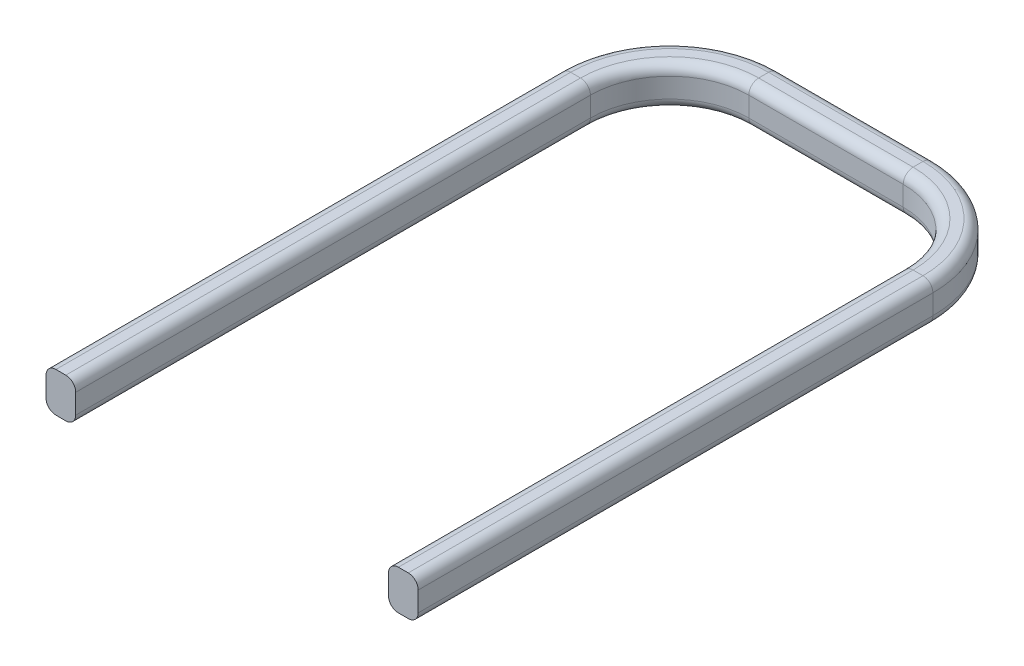
ISO-10303-21;
HEADER;
FILE_DESCRIPTION(('STEP AP214'),'2;1');
FILE_NAME('part.step','',(''),(''),'','','');
FILE_SCHEMA(('AUTOMOTIVE_DESIGN { 1 0 10303 214 1 1 1 1 }'));
ENDSEC;
DATA;
#1=APPLICATION_CONTEXT('core data for automotive mechanical design processes');
#2=APPLICATION_PROTOCOL_DEFINITION('international standard','automotive_design',2000,#1);
#3=PRODUCT_CONTEXT('',#1,'mechanical');
#4=PRODUCT('Part','Part','',(#3));
#5=PRODUCT_RELATED_PRODUCT_CATEGORY('part','',(#4));
#6=PRODUCT_DEFINITION_FORMATION('','',#4);
#7=PRODUCT_DEFINITION_CONTEXT('part definition',#1,'design');
#8=PRODUCT_DEFINITION('design','',#6,#7);
#9=PRODUCT_DEFINITION_SHAPE('','',#8);
#10=(LENGTH_UNIT() NAMED_UNIT(*) SI_UNIT(.MILLI.,.METRE.));
#11=(NAMED_UNIT(*) PLANE_ANGLE_UNIT() SI_UNIT($,.RADIAN.));
#12=(NAMED_UNIT(*) SI_UNIT($,.STERADIAN.) SOLID_ANGLE_UNIT());
#13=UNCERTAINTY_MEASURE_WITH_UNIT(LENGTH_MEASURE(1.E-05),#10,'distance_accuracy_value','');
#14=(GEOMETRIC_REPRESENTATION_CONTEXT(3) GLOBAL_UNCERTAINTY_ASSIGNED_CONTEXT((#13)) GLOBAL_UNIT_ASSIGNED_CONTEXT((#10,
#11,#12)) REPRESENTATION_CONTEXT('',''));
#15=CARTESIAN_POINT('',(0.,0.,0.));
#16=DIRECTION('',(0.,0.,1.));
#17=DIRECTION('',(1.,0.,0.));
#18=AXIS2_PLACEMENT_3D('',#15,#16,#17);
#19=CARTESIAN_POINT('',(0.,0.,0.));
#20=DIRECTION('',(0.,0.,1.));
#21=DIRECTION('',(1.,0.,0.));
#22=AXIS2_PLACEMENT_3D('',#19,#20,#21);
#23=PLANE('',#22);
#24=DIRECTION('',(0.,-1.,0.));
#25=VECTOR('',#24,1.);
#26=CARTESIAN_POINT('',(-4.7,0.,0.));
#27=LINE('',#26,#25);
#28=CARTESIAN_POINT('',(-4.7,0.75,0.));
#29=VERTEX_POINT('',#28);
#30=CARTESIAN_POINT('',(-4.7,0.25,0.));
#31=VERTEX_POINT('',#30);
#32=EDGE_CURVE('E493',#29,#31,#27,.T.);
#33=ORIENTED_EDGE('',*,*,#32,.T.);
#34=CARTESIAN_POINT('',(-4.45,0.25,0.));
#35=DIRECTION('',(0.,0.,1.));
#36=DIRECTION('',(1.,0.,0.));
#37=AXIS2_PLACEMENT_3D('',#34,#35,#36);
#38=CIRCLE('',#37,0.25);
#39=CARTESIAN_POINT('',(-4.45,0.,0.));
#40=VERTEX_POINT('',#39);
#41=EDGE_CURVE('E295',#31,#40,#38,.T.);
#42=ORIENTED_EDGE('',*,*,#41,.T.);
#43=DIRECTION('',(1.,0.,0.));
#44=VECTOR('',#43,1.);
#45=CARTESIAN_POINT('',(-3.95,0.,0.));
#46=LINE('',#45,#44);
#47=CARTESIAN_POINT('',(-4.2,0.,0.));
#48=VERTEX_POINT('',#47);
#49=EDGE_CURVE('E236',#40,#48,#46,.T.);
#50=ORIENTED_EDGE('',*,*,#49,.T.);
#51=CARTESIAN_POINT('',(-4.2,0.25,0.));
#52=DIRECTION('',(0.,0.,1.));
#53=DIRECTION('',(1.,0.,0.));
#54=AXIS2_PLACEMENT_3D('',#51,#52,#53);
#55=CIRCLE('',#54,0.25);
#56=CARTESIAN_POINT('',(-3.95,0.25,0.));
#57=VERTEX_POINT('',#56);
#58=EDGE_CURVE('E292',#48,#57,#55,.T.);
#59=ORIENTED_EDGE('',*,*,#58,.T.);
#60=DIRECTION('',(0.,1.,0.));
#61=VECTOR('',#60,1.);
#62=CARTESIAN_POINT('',(-3.95,0.,0.));
#63=LINE('',#62,#61);
#64=CARTESIAN_POINT('',(-3.95,0.75,0.));
#65=VERTEX_POINT('',#64);
#66=EDGE_CURVE('E421',#57,#65,#63,.T.);
#67=ORIENTED_EDGE('',*,*,#66,.T.);
#68=CARTESIAN_POINT('',(-4.2,0.75,0.));
#69=DIRECTION('',(0.,0.,1.));
#70=DIRECTION('',(1.,0.,0.));
#71=AXIS2_PLACEMENT_3D('',#68,#69,#70);
#72=CIRCLE('',#71,0.25);
#73=CARTESIAN_POINT('',(-4.2,1.,0.));
#74=VERTEX_POINT('',#73);
#75=EDGE_CURVE('E286',#65,#74,#72,.T.);
#76=ORIENTED_EDGE('',*,*,#75,.T.);
#77=DIRECTION('',(-1.,0.,0.));
#78=VECTOR('',#77,1.);
#79=CARTESIAN_POINT('',(-3.95,1.,0.));
#80=LINE('',#79,#78);
#81=CARTESIAN_POINT('',(-4.45,1.,0.));
#82=VERTEX_POINT('',#81);
#83=EDGE_CURVE('E490',#74,#82,#80,.T.);
#84=ORIENTED_EDGE('',*,*,#83,.T.);
#85=CARTESIAN_POINT('',(-4.45,0.75,0.));
#86=DIRECTION('',(0.,0.,1.));
#87=DIRECTION('',(1.,0.,0.));
#88=AXIS2_PLACEMENT_3D('',#85,#86,#87);
#89=CIRCLE('',#88,0.25);
#90=EDGE_CURVE('E289',#82,#29,#89,.T.);
#91=ORIENTED_EDGE('',*,*,#90,.T.);
#92=EDGE_LOOP('',(#33,#42,#50,#59,#67,#76,#84,#91));
#93=FACE_BOUND('',#92,.T.);
#94=ADVANCED_FACE('F39',(#93),#23,.T.);
#95=CARTESIAN_POINT('',(0.,0.,0.));
#96=DIRECTION('',(0.,0.,-1.));
#97=DIRECTION('',(-1.,0.,0.));
#98=AXIS2_PLACEMENT_3D('',#95,#96,#97);
#99=PLANE('',#98);
#100=DIRECTION('',(0.,1.,0.));
#101=VECTOR('',#100,1.);
#102=CARTESIAN_POINT('',(3.95,0.,0.));
#103=LINE('',#102,#101);
#104=CARTESIAN_POINT('',(3.95,0.25,0.));
#105=VERTEX_POINT('',#104);
#106=CARTESIAN_POINT('',(3.95,0.75,0.));
#107=VERTEX_POINT('',#106);
#108=EDGE_CURVE('E273',#105,#107,#103,.T.);
#109=ORIENTED_EDGE('',*,*,#108,.F.);
#110=CARTESIAN_POINT('',(4.2,0.25,0.));
#111=DIRECTION('',(0.,0.,-1.));
#112=DIRECTION('',(-1.,0.,0.));
#113=AXIS2_PLACEMENT_3D('',#110,#111,#112);
#114=CIRCLE('',#113,0.25);
#115=CARTESIAN_POINT('',(4.2,0.,0.));
#116=VERTEX_POINT('',#115);
#117=EDGE_CURVE('E345',#105,#116,#114,.F.);
#118=ORIENTED_EDGE('',*,*,#117,.T.);
#119=DIRECTION('',(-1.,0.,0.));
#120=VECTOR('',#119,1.);
#121=CARTESIAN_POINT('',(3.95,0.,0.));
#122=LINE('',#121,#120);
#123=CARTESIAN_POINT('',(4.45,0.,0.));
#124=VERTEX_POINT('',#123);
#125=EDGE_CURVE('E275',#124,#116,#122,.T.);
#126=ORIENTED_EDGE('',*,*,#125,.F.);
#127=CARTESIAN_POINT('',(4.45,0.25,0.));
#128=DIRECTION('',(0.,0.,-1.));
#129=DIRECTION('',(-1.,0.,0.));
#130=AXIS2_PLACEMENT_3D('',#127,#128,#129);
#131=CIRCLE('',#130,0.25);
#132=CARTESIAN_POINT('',(4.7,0.25,0.));
#133=VERTEX_POINT('',#132);
#134=EDGE_CURVE('E336',#124,#133,#131,.F.);
#135=ORIENTED_EDGE('',*,*,#134,.T.);
#136=DIRECTION('',(0.,-1.,0.));
#137=VECTOR('',#136,1.);
#138=CARTESIAN_POINT('',(4.7,0.,0.));
#139=LINE('',#138,#137);
#140=CARTESIAN_POINT('',(4.7,0.75,0.));
#141=VERTEX_POINT('',#140);
#142=EDGE_CURVE('E279',#141,#133,#139,.T.);
#143=ORIENTED_EDGE('',*,*,#142,.F.);
#144=CARTESIAN_POINT('',(4.45,0.75,0.));
#145=DIRECTION('',(0.,0.,-1.));
#146=DIRECTION('',(-1.,0.,0.));
#147=AXIS2_PLACEMENT_3D('',#144,#145,#146);
#148=CIRCLE('',#147,0.25);
#149=CARTESIAN_POINT('',(4.45,1.,0.));
#150=VERTEX_POINT('',#149);
#151=EDGE_CURVE('E342',#141,#150,#148,.F.);
#152=ORIENTED_EDGE('',*,*,#151,.T.);
#153=DIRECTION('',(1.,0.,0.));
#154=VECTOR('',#153,1.);
#155=CARTESIAN_POINT('',(3.95,1.,0.));
#156=LINE('',#155,#154);
#157=CARTESIAN_POINT('',(4.2,1.,0.));
#158=VERTEX_POINT('',#157);
#159=EDGE_CURVE('E508',#158,#150,#156,.T.);
#160=ORIENTED_EDGE('',*,*,#159,.F.);
#161=CARTESIAN_POINT('',(4.2,0.75,0.));
#162=DIRECTION('',(0.,0.,-1.));
#163=DIRECTION('',(-1.,0.,0.));
#164=AXIS2_PLACEMENT_3D('',#161,#162,#163);
#165=CIRCLE('',#164,0.25);
#166=EDGE_CURVE('E339',#158,#107,#165,.F.);
#167=ORIENTED_EDGE('',*,*,#166,.T.);
#168=EDGE_LOOP('',(#109,#118,#126,#135,#143,#152,#160,#167));
#169=FACE_BOUND('',#168,.T.);
#170=ADVANCED_FACE('F575',(#169),#99,.F.);
#171=CARTESIAN_POINT('',(-3.95,0.,0.));
#172=DIRECTION('',(-1.,0.,0.));
#173=DIRECTION('',(0.,0.,1.));
#174=AXIS2_PLACEMENT_3D('',#171,#172,#173);
#175=PLANE('',#174);
#176=ORIENTED_EDGE('',*,*,#66,.F.);
#177=DIRECTION('',(0.,0.,-1.));
#178=VECTOR('',#177,1.);
#179=CARTESIAN_POINT('',(-3.95,0.25,0.));
#180=LINE('',#179,#178);
#181=CARTESIAN_POINT('',(-3.95,0.25,-13.));
#182=VERTEX_POINT('',#181);
#183=EDGE_CURVE('E406',#57,#182,#180,.T.);
#184=ORIENTED_EDGE('',*,*,#183,.T.);
#185=DIRECTION('',(0.,1.,0.));
#186=VECTOR('',#185,1.);
#187=CARTESIAN_POINT('',(-3.95,0.,-13.));
#188=LINE('',#187,#186);
#189=CARTESIAN_POINT('',(-3.95,0.75,-13.));
#190=VERTEX_POINT('',#189);
#191=EDGE_CURVE('E484',#182,#190,#188,.T.);
#192=ORIENTED_EDGE('',*,*,#191,.T.);
#193=DIRECTION('',(0.,0.,-1.));
#194=VECTOR('',#193,1.);
#195=CARTESIAN_POINT('',(-3.95,0.75,0.));
#196=LINE('',#195,#194);
#197=EDGE_CURVE('E403',#190,#65,#196,.F.);
#198=ORIENTED_EDGE('',*,*,#197,.T.);
#199=EDGE_LOOP('',(#176,#184,#192,#198));
#200=FACE_BOUND('',#199,.T.);
#201=ADVANCED_FACE('F481',(#200),#175,.F.);
#202=CARTESIAN_POINT('',(-3.95,1.,0.));
#203=DIRECTION('',(0.,-1.,0.));
#204=DIRECTION('',(1.,0.,0.));
#205=AXIS2_PLACEMENT_3D('',#202,#203,#204);
#206=PLANE('',#205);
#207=DIRECTION('',(-1.,0.,0.));
#208=VECTOR('',#207,1.);
#209=CARTESIAN_POINT('',(-3.95,1.,-13.));
#210=LINE('',#209,#208);
#211=CARTESIAN_POINT('',(-4.2,1.,-13.));
#212=VERTEX_POINT('',#211);
#213=CARTESIAN_POINT('',(-4.45,1.,-13.));
#214=VERTEX_POINT('',#213);
#215=EDGE_CURVE('E253',#212,#214,#210,.T.);
#216=ORIENTED_EDGE('',*,*,#215,.T.);
#217=DIRECTION('',(0.,0.,-1.));
#218=VECTOR('',#217,1.);
#219=CARTESIAN_POINT('',(-4.45,1.,0.));
#220=LINE('',#219,#218);
#221=EDGE_CURVE('E11',#214,#82,#220,.F.);
#222=ORIENTED_EDGE('',*,*,#221,.T.);
#223=ORIENTED_EDGE('',*,*,#83,.F.);
#224=DIRECTION('',(0.,0.,-1.));
#225=VECTOR('',#224,1.);
#226=CARTESIAN_POINT('',(-4.2,1.,0.));
#227=LINE('',#226,#225);
#228=EDGE_CURVE('E49',#74,#212,#227,.T.);
#229=ORIENTED_EDGE('',*,*,#228,.T.);
#230=EDGE_LOOP('',(#216,#222,#223,#229));
#231=FACE_BOUND('',#230,.T.);
#232=ADVANCED_FACE('F913',(#231),#206,.F.);
#233=CARTESIAN_POINT('',(-4.7,0.,0.));
#234=DIRECTION('',(1.,0.,0.));
#235=DIRECTION('',(0.,0.,-1.));
#236=AXIS2_PLACEMENT_3D('',#233,#234,#235);
#237=PLANE('',#236);
#238=DIRECTION('',(0.,-1.,0.));
#239=VECTOR('',#238,1.);
#240=CARTESIAN_POINT('',(-4.7,0.,-13.));
#241=LINE('',#240,#239);
#242=CARTESIAN_POINT('',(-4.7,0.75,-13.));
#243=VERTEX_POINT('',#242);
#244=CARTESIAN_POINT('',(-4.7,0.25,-13.));
#245=VERTEX_POINT('',#244);
#246=EDGE_CURVE('E245',#243,#245,#241,.T.);
#247=ORIENTED_EDGE('',*,*,#246,.T.);
#248=DIRECTION('',(0.,0.,-1.));
#249=VECTOR('',#248,1.);
#250=CARTESIAN_POINT('',(-4.7,0.25,0.));
#251=LINE('',#250,#249);
#252=EDGE_CURVE('E210',#245,#31,#251,.F.);
#253=ORIENTED_EDGE('',*,*,#252,.T.);
#254=ORIENTED_EDGE('',*,*,#32,.F.);
#255=DIRECTION('',(0.,0.,-1.));
#256=VECTOR('',#255,1.);
#257=CARTESIAN_POINT('',(-4.7,0.75,0.));
#258=LINE('',#257,#256);
#259=EDGE_CURVE('E238',#29,#243,#258,.T.);
#260=ORIENTED_EDGE('',*,*,#259,.T.);
#261=EDGE_LOOP('',(#247,#253,#254,#260));
#262=FACE_BOUND('',#261,.T.);
#263=ADVANCED_FACE('F623',(#262),#237,.F.);
#264=CARTESIAN_POINT('',(-3.95,0.,0.));
#265=DIRECTION('',(0.,1.,0.));
#266=DIRECTION('',(-1.,0.,0.));
#267=AXIS2_PLACEMENT_3D('',#264,#265,#266);
#268=PLANE('',#267);
#269=ORIENTED_EDGE('',*,*,#49,.F.);
#270=DIRECTION('',(0.,0.,-1.));
#271=VECTOR('',#270,1.);
#272=CARTESIAN_POINT('',(-4.45,0.,0.));
#273=LINE('',#272,#271);
#274=CARTESIAN_POINT('',(-4.45,0.,-13.));
#275=VERTEX_POINT('',#274);
#276=EDGE_CURVE('E209',#40,#275,#273,.T.);
#277=ORIENTED_EDGE('',*,*,#276,.T.);
#278=DIRECTION('',(1.,0.,0.));
#279=VECTOR('',#278,1.);
#280=CARTESIAN_POINT('',(-3.95,0.,-13.));
#281=LINE('',#280,#279);
#282=CARTESIAN_POINT('',(-4.2,0.,-13.));
#283=VERTEX_POINT('',#282);
#284=EDGE_CURVE('E233',#275,#283,#281,.T.);
#285=ORIENTED_EDGE('',*,*,#284,.T.);
#286=DIRECTION('',(0.,0.,-1.));
#287=VECTOR('',#286,1.);
#288=CARTESIAN_POINT('',(-4.2,0.,0.));
#289=LINE('',#288,#287);
#290=EDGE_CURVE('E239',#283,#48,#289,.F.);
#291=ORIENTED_EDGE('',*,*,#290,.T.);
#292=EDGE_LOOP('',(#269,#277,#285,#291));
#293=FACE_BOUND('',#292,.T.);
#294=ADVANCED_FACE('F232',(#293),#268,.F.);
#295=CARTESIAN_POINT('',(-1.95,0.,-13.));
#296=DIRECTION('',(0.,-1.,0.));
#297=DIRECTION('',(0.,0.,-1.));
#298=AXIS2_PLACEMENT_3D('',#295,#296,#297);
#299=CYLINDRICAL_SURFACE('',#298,2.);
#300=ORIENTED_EDGE('',*,*,#191,.F.);
#301=CARTESIAN_POINT('',(-1.95,0.25,-13.));
#302=DIRECTION('',(0.,1.,0.));
#303=DIRECTION('',(0.,0.,1.));
#304=AXIS2_PLACEMENT_3D('',#301,#302,#303);
#305=CIRCLE('',#304,2.);
#306=CARTESIAN_POINT('',(-1.95,0.25,-15.));
#307=VERTEX_POINT('',#306);
#308=EDGE_CURVE('E369',#182,#307,#305,.F.);
#309=ORIENTED_EDGE('',*,*,#308,.T.);
#310=DIRECTION('',(0.,1.,0.));
#311=VECTOR('',#310,1.);
#312=CARTESIAN_POINT('',(-1.95,0.,-15.));
#313=LINE('',#312,#311);
#314=CARTESIAN_POINT('',(-1.95,0.75,-15.));
#315=VERTEX_POINT('',#314);
#316=EDGE_CURVE('E244',#307,#315,#313,.T.);
#317=ORIENTED_EDGE('',*,*,#316,.T.);
#318=CARTESIAN_POINT('',(-1.95,0.75,-13.));
#319=DIRECTION('',(0.,-1.,0.));
#320=DIRECTION('',(0.,0.,-1.));
#321=AXIS2_PLACEMENT_3D('',#318,#319,#320);
#322=CIRCLE('',#321,2.);
#323=EDGE_CURVE('E366',#315,#190,#322,.F.);
#324=ORIENTED_EDGE('',*,*,#323,.T.);
#325=EDGE_LOOP('',(#300,#309,#317,#324));
#326=FACE_BOUND('',#325,.T.);
#327=ADVANCED_FACE('F887',(#326),#299,.F.);
#328=CARTESIAN_POINT('',(-3.95,1.,-13.));
#329=DIRECTION('',(0.,-1.,0.));
#330=DIRECTION('',(0.,0.,-1.));
#331=AXIS2_PLACEMENT_3D('',#328,#329,#330);
#332=PLANE('',#331);
#333=DIRECTION('',(0.,0.,-1.));
#334=VECTOR('',#333,1.);
#335=CARTESIAN_POINT('',(-1.95,1.,-15.));
#336=LINE('',#335,#334);
#337=CARTESIAN_POINT('',(-1.95,1.,-15.25));
#338=VERTEX_POINT('',#337);
#339=CARTESIAN_POINT('',(-1.95,1.,-15.5));
#340=VERTEX_POINT('',#339);
#341=EDGE_CURVE('E250',#338,#340,#336,.T.);
#342=ORIENTED_EDGE('',*,*,#341,.T.);
#343=CARTESIAN_POINT('',(-1.95,1.,-13.));
#344=DIRECTION('',(0.,-1.,0.));
#345=DIRECTION('',(0.,0.,-1.));
#346=AXIS2_PLACEMENT_3D('',#343,#344,#345);
#347=CIRCLE('',#346,2.5);
#348=EDGE_CURVE('E57',#340,#214,#347,.F.);
#349=ORIENTED_EDGE('',*,*,#348,.T.);
#350=ORIENTED_EDGE('',*,*,#215,.F.);
#351=CARTESIAN_POINT('',(-1.95,1.,-13.));
#352=DIRECTION('',(0.,-1.,0.));
#353=DIRECTION('',(0.,0.,-1.));
#354=AXIS2_PLACEMENT_3D('',#351,#352,#353);
#355=CIRCLE('',#354,2.25);
#356=EDGE_CURVE('E398',#212,#338,#355,.T.);
#357=ORIENTED_EDGE('',*,*,#356,.T.);
#358=EDGE_LOOP('',(#342,#349,#350,#357));
#359=FACE_BOUND('',#358,.T.);
#360=ADVANCED_FACE('F878',(#359),#332,.F.);
#361=CARTESIAN_POINT('',(-1.95,0.,-13.));
#362=DIRECTION('',(0.,-1.,0.));
#363=DIRECTION('',(0.,0.,-1.));
#364=AXIS2_PLACEMENT_3D('',#361,#362,#363);
#365=CYLINDRICAL_SURFACE('',#364,2.75);
#366=DIRECTION('',(0.,-1.,0.));
#367=VECTOR('',#366,1.);
#368=CARTESIAN_POINT('',(-1.95,0.,-15.75));
#369=LINE('',#368,#367);
#370=CARTESIAN_POINT('',(-1.95,0.75,-15.75));
#371=VERTEX_POINT('',#370);
#372=CARTESIAN_POINT('',(-1.95,0.25,-15.75));
#373=VERTEX_POINT('',#372);
#374=EDGE_CURVE('E262',#371,#373,#369,.T.);
#375=ORIENTED_EDGE('',*,*,#374,.T.);
#376=CARTESIAN_POINT('',(-1.95,0.25,-13.));
#377=DIRECTION('',(0.,1.,0.));
#378=DIRECTION('',(0.,0.,1.));
#379=AXIS2_PLACEMENT_3D('',#376,#377,#378);
#380=CIRCLE('',#379,2.75);
#381=EDGE_CURVE('E302',#373,#245,#380,.T.);
#382=ORIENTED_EDGE('',*,*,#381,.T.);
#383=ORIENTED_EDGE('',*,*,#246,.F.);
#384=CARTESIAN_POINT('',(-1.95,0.75,-13.));
#385=DIRECTION('',(0.,-1.,0.));
#386=DIRECTION('',(0.,0.,-1.));
#387=AXIS2_PLACEMENT_3D('',#384,#385,#386);
#388=CIRCLE('',#387,2.75);
#389=EDGE_CURVE('E226',#243,#371,#388,.T.);
#390=ORIENTED_EDGE('',*,*,#389,.T.);
#391=EDGE_LOOP('',(#375,#382,#383,#390));
#392=FACE_BOUND('',#391,.T.);
#393=ADVANCED_FACE('F633',(#392),#365,.T.);
#394=CARTESIAN_POINT('',(-3.95,0.,-13.));
#395=DIRECTION('',(0.,1.,0.));
#396=DIRECTION('',(0.,0.,1.));
#397=AXIS2_PLACEMENT_3D('',#394,#395,#396);
#398=PLANE('',#397);
#399=ORIENTED_EDGE('',*,*,#284,.F.);
#400=CARTESIAN_POINT('',(-1.95,0.,-13.));
#401=DIRECTION('',(0.,1.,0.));
#402=DIRECTION('',(0.,0.,1.));
#403=AXIS2_PLACEMENT_3D('',#400,#401,#402);
#404=CIRCLE('',#403,2.5);
#405=CARTESIAN_POINT('',(-1.95,0.,-15.5));
#406=VERTEX_POINT('',#405);
#407=EDGE_CURVE('E218',#275,#406,#404,.F.);
#408=ORIENTED_EDGE('',*,*,#407,.T.);
#409=DIRECTION('',(0.,0.,1.));
#410=VECTOR('',#409,1.);
#411=CARTESIAN_POINT('',(-1.95,0.,-15.));
#412=LINE('',#411,#410);
#413=CARTESIAN_POINT('',(-1.95,0.,-15.25));
#414=VERTEX_POINT('',#413);
#415=EDGE_CURVE('E258',#406,#414,#412,.T.);
#416=ORIENTED_EDGE('',*,*,#415,.T.);
#417=CARTESIAN_POINT('',(-1.95,0.,-13.));
#418=DIRECTION('',(0.,1.,0.));
#419=DIRECTION('',(0.,0.,1.));
#420=AXIS2_PLACEMENT_3D('',#417,#418,#419);
#421=CIRCLE('',#420,2.25);
#422=EDGE_CURVE('E227',#414,#283,#421,.T.);
#423=ORIENTED_EDGE('',*,*,#422,.T.);
#424=EDGE_LOOP('',(#399,#408,#416,#423));
#425=FACE_BOUND('',#424,.T.);
#426=ADVANCED_FACE('F241',(#425),#398,.F.);
#427=CARTESIAN_POINT('',(-1.95,0.,-15.));
#428=DIRECTION('',(0.,0.,-1.));
#429=DIRECTION('',(-1.,0.,0.));
#430=AXIS2_PLACEMENT_3D('',#427,#428,#429);
#431=PLANE('',#430);
#432=ORIENTED_EDGE('',*,*,#316,.F.);
#433=DIRECTION('',(1.,0.,0.));
#434=VECTOR('',#433,1.);
#435=CARTESIAN_POINT('',(-1.95,0.25,-15.));
#436=LINE('',#435,#434);
#437=CARTESIAN_POINT('',(1.94999999999999,0.25,-15.));
#438=VERTEX_POINT('',#437);
#439=EDGE_CURVE('E363',#307,#438,#436,.T.);
#440=ORIENTED_EDGE('',*,*,#439,.T.);
#441=DIRECTION('',(0.,1.,0.));
#442=VECTOR('',#441,1.);
#443=CARTESIAN_POINT('',(1.94999999999999,0.,-15.));
#444=LINE('',#443,#442);
#445=CARTESIAN_POINT('',(1.94999999999999,0.75,-15.));
#446=VERTEX_POINT('',#445);
#447=EDGE_CURVE('E261',#438,#446,#444,.T.);
#448=ORIENTED_EDGE('',*,*,#447,.T.);
#449=DIRECTION('',(1.,0.,0.));
#450=VECTOR('',#449,1.);
#451=CARTESIAN_POINT('',(-1.95,0.75,-15.));
#452=LINE('',#451,#450);
#453=EDGE_CURVE('E360',#446,#315,#452,.F.);
#454=ORIENTED_EDGE('',*,*,#453,.T.);
#455=EDGE_LOOP('',(#432,#440,#448,#454));
#456=FACE_BOUND('',#455,.T.);
#457=ADVANCED_FACE('F851',(#456),#431,.F.);
#458=CARTESIAN_POINT('',(-1.95,1.,-15.));
#459=DIRECTION('',(0.,-1.,0.));
#460=DIRECTION('',(0.,0.,-1.));
#461=AXIS2_PLACEMENT_3D('',#458,#459,#460);
#462=PLANE('',#461);
#463=DIRECTION('',(0.,0.,-1.));
#464=VECTOR('',#463,1.);
#465=CARTESIAN_POINT('',(1.94999999999999,1.,-15.));
#466=LINE('',#465,#464);
#467=CARTESIAN_POINT('',(1.94999999999999,1.,-15.25));
#468=VERTEX_POINT('',#467);
#469=CARTESIAN_POINT('',(1.94999999999999,1.,-15.5));
#470=VERTEX_POINT('',#469);
#471=EDGE_CURVE('E501',#468,#470,#466,.T.);
#472=ORIENTED_EDGE('',*,*,#471,.T.);
#473=DIRECTION('',(1.,0.,0.));
#474=VECTOR('',#473,1.);
#475=CARTESIAN_POINT('',(-1.95,1.,-15.5));
#476=LINE('',#475,#474);
#477=EDGE_CURVE('E395',#470,#340,#476,.F.);
#478=ORIENTED_EDGE('',*,*,#477,.T.);
#479=ORIENTED_EDGE('',*,*,#341,.F.);
#480=DIRECTION('',(1.,0.,0.));
#481=VECTOR('',#480,1.);
#482=CARTESIAN_POINT('',(-1.95,1.,-15.25));
#483=LINE('',#482,#481);
#484=EDGE_CURVE('E392',#338,#468,#483,.T.);
#485=ORIENTED_EDGE('',*,*,#484,.T.);
#486=EDGE_LOOP('',(#472,#478,#479,#485));
#487=FACE_BOUND('',#486,.T.);
#488=ADVANCED_FACE('F842',(#487),#462,.F.);
#489=CARTESIAN_POINT('',(-1.95,0.,-15.75));
#490=DIRECTION('',(0.,0.,1.));
#491=DIRECTION('',(1.,0.,0.));
#492=AXIS2_PLACEMENT_3D('',#489,#490,#491);
#493=PLANE('',#492);
#494=DIRECTION('',(0.,-1.,0.));
#495=VECTOR('',#494,1.);
#496=CARTESIAN_POINT('',(1.94999999999999,0.,-15.75));
#497=LINE('',#496,#495);
#498=CARTESIAN_POINT('',(1.94999999999999,0.75,-15.75));
#499=VERTEX_POINT('',#498);
#500=CARTESIAN_POINT('',(1.94999999999999,0.25,-15.75));
#501=VERTEX_POINT('',#500);
#502=EDGE_CURVE('E268',#499,#501,#497,.T.);
#503=ORIENTED_EDGE('',*,*,#502,.T.);
#504=DIRECTION('',(1.,0.,0.));
#505=VECTOR('',#504,1.);
#506=CARTESIAN_POINT('',(-1.95,0.25,-15.75));
#507=LINE('',#506,#505);
#508=EDGE_CURVE('E314',#501,#373,#507,.F.);
#509=ORIENTED_EDGE('',*,*,#508,.T.);
#510=ORIENTED_EDGE('',*,*,#374,.F.);
#511=DIRECTION('',(1.,0.,0.));
#512=VECTOR('',#511,1.);
#513=CARTESIAN_POINT('',(-1.95,0.75,-15.75));
#514=LINE('',#513,#512);
#515=EDGE_CURVE('E311',#371,#499,#514,.T.);
#516=ORIENTED_EDGE('',*,*,#515,.T.);
#517=EDGE_LOOP('',(#503,#509,#510,#516));
#518=FACE_BOUND('',#517,.T.);
#519=ADVANCED_FACE('F558',(#518),#493,.F.);
#520=CARTESIAN_POINT('',(-1.95,0.,-15.));
#521=DIRECTION('',(0.,1.,0.));
#522=DIRECTION('',(0.,0.,1.));
#523=AXIS2_PLACEMENT_3D('',#520,#521,#522);
#524=PLANE('',#523);
#525=ORIENTED_EDGE('',*,*,#415,.F.);
#526=DIRECTION('',(1.,0.,0.));
#527=VECTOR('',#526,1.);
#528=CARTESIAN_POINT('',(-1.95,0.,-15.5));
#529=LINE('',#528,#527);
#530=CARTESIAN_POINT('',(1.94999999999999,0.,-15.5));
#531=VERTEX_POINT('',#530);
#532=EDGE_CURVE('E308',#406,#531,#529,.T.);
#533=ORIENTED_EDGE('',*,*,#532,.T.);
#534=DIRECTION('',(0.,0.,1.));
#535=VECTOR('',#534,1.);
#536=CARTESIAN_POINT('',(1.94999999999999,0.,-15.));
#537=LINE('',#536,#535);
#538=CARTESIAN_POINT('',(1.94999999999999,0.,-15.25));
#539=VERTEX_POINT('',#538);
#540=EDGE_CURVE('E263',#531,#539,#537,.T.);
#541=ORIENTED_EDGE('',*,*,#540,.T.);
#542=DIRECTION('',(1.,0.,0.));
#543=VECTOR('',#542,1.);
#544=CARTESIAN_POINT('',(-1.95,0.,-15.25));
#545=LINE('',#544,#543);
#546=EDGE_CURVE('E305',#539,#414,#545,.F.);
#547=ORIENTED_EDGE('',*,*,#546,.T.);
#548=EDGE_LOOP('',(#525,#533,#541,#547));
#549=FACE_BOUND('',#548,.T.);
#550=ADVANCED_FACE('F610',(#549),#524,.F.);
#551=CARTESIAN_POINT('',(1.95,0.,-13.));
#552=DIRECTION('',(0.,-1.,0.));
#553=DIRECTION('',(0.,0.,-1.));
#554=AXIS2_PLACEMENT_3D('',#551,#552,#553);
#555=CYLINDRICAL_SURFACE('',#554,2.);
#556=ORIENTED_EDGE('',*,*,#447,.F.);
#557=CARTESIAN_POINT('',(1.95,0.25,-13.));
#558=DIRECTION('',(0.,1.,0.));
#559=DIRECTION('',(0.,0.,1.));
#560=AXIS2_PLACEMENT_3D('',#557,#558,#559);
#561=CIRCLE('',#560,2.);
#562=CARTESIAN_POINT('',(3.95,0.25,-13.));
#563=VERTEX_POINT('',#562);
#564=EDGE_CURVE('E357',#438,#563,#561,.F.);
#565=ORIENTED_EDGE('',*,*,#564,.T.);
#566=DIRECTION('',(0.,1.,0.));
#567=VECTOR('',#566,1.);
#568=CARTESIAN_POINT('',(3.95,0.,-13.));
#569=LINE('',#568,#567);
#570=CARTESIAN_POINT('',(3.95,0.75,-13.));
#571=VERTEX_POINT('',#570);
#572=EDGE_CURVE('E267',#563,#571,#569,.T.);
#573=ORIENTED_EDGE('',*,*,#572,.T.);
#574=CARTESIAN_POINT('',(1.95,0.75,-13.));
#575=DIRECTION('',(0.,-1.,0.));
#576=DIRECTION('',(0.,0.,-1.));
#577=AXIS2_PLACEMENT_3D('',#574,#575,#576);
#578=CIRCLE('',#577,2.);
#579=EDGE_CURVE('E354',#571,#446,#578,.F.);
#580=ORIENTED_EDGE('',*,*,#579,.T.);
#581=EDGE_LOOP('',(#556,#565,#573,#580));
#582=FACE_BOUND('',#581,.T.);
#583=ADVANCED_FACE('F816',(#582),#555,.F.);
#584=CARTESIAN_POINT('',(1.94999999999999,1.,-15.));
#585=DIRECTION('',(0.,-1.,0.));
#586=DIRECTION('',(0.,0.,-1.));
#587=AXIS2_PLACEMENT_3D('',#584,#585,#586);
#588=PLANE('',#587);
#589=DIRECTION('',(1.,0.,0.));
#590=VECTOR('',#589,1.);
#591=CARTESIAN_POINT('',(3.95,1.,-13.));
#592=LINE('',#591,#590);
#593=CARTESIAN_POINT('',(4.2,1.,-13.));
#594=VERTEX_POINT('',#593);
#595=CARTESIAN_POINT('',(4.45,1.,-13.));
#596=VERTEX_POINT('',#595);
#597=EDGE_CURVE('E505',#594,#596,#592,.T.);
#598=ORIENTED_EDGE('',*,*,#597,.T.);
#599=CARTESIAN_POINT('',(1.95,1.,-13.));
#600=DIRECTION('',(0.,-1.,0.));
#601=DIRECTION('',(0.,0.,-1.));
#602=AXIS2_PLACEMENT_3D('',#599,#600,#601);
#603=CIRCLE('',#602,2.5);
#604=EDGE_CURVE('E389',#596,#470,#603,.F.);
#605=ORIENTED_EDGE('',*,*,#604,.T.);
#606=ORIENTED_EDGE('',*,*,#471,.F.);
#607=CARTESIAN_POINT('',(1.95,1.,-13.));
#608=DIRECTION('',(0.,-1.,0.));
#609=DIRECTION('',(0.,0.,-1.));
#610=AXIS2_PLACEMENT_3D('',#607,#608,#609);
#611=CIRCLE('',#610,2.25);
#612=EDGE_CURVE('E386',#468,#594,#611,.T.);
#613=ORIENTED_EDGE('',*,*,#612,.T.);
#614=EDGE_LOOP('',(#598,#605,#606,#613));
#615=FACE_BOUND('',#614,.T.);
#616=ADVANCED_FACE('F807',(#615),#588,.F.);
#617=CARTESIAN_POINT('',(1.95,0.,-13.));
#618=DIRECTION('',(0.,-1.,0.));
#619=DIRECTION('',(0.,0.,-1.));
#620=AXIS2_PLACEMENT_3D('',#617,#618,#619);
#621=CYLINDRICAL_SURFACE('',#620,2.75);
#622=DIRECTION('',(0.,-1.,0.));
#623=VECTOR('',#622,1.);
#624=CARTESIAN_POINT('',(4.7,0.,-13.));
#625=LINE('',#624,#623);
#626=CARTESIAN_POINT('',(4.7,0.75,-13.));
#627=VERTEX_POINT('',#626);
#628=CARTESIAN_POINT('',(4.7,0.25,-13.));
#629=VERTEX_POINT('',#628);
#630=EDGE_CURVE('E274',#627,#629,#625,.T.);
#631=ORIENTED_EDGE('',*,*,#630,.T.);
#632=CARTESIAN_POINT('',(1.95,0.25,-13.));
#633=DIRECTION('',(0.,1.,0.));
#634=DIRECTION('',(0.,0.,1.));
#635=AXIS2_PLACEMENT_3D('',#632,#633,#634);
#636=CIRCLE('',#635,2.75);
#637=EDGE_CURVE('E326',#629,#501,#636,.T.);
#638=ORIENTED_EDGE('',*,*,#637,.T.);
#639=ORIENTED_EDGE('',*,*,#502,.F.);
#640=CARTESIAN_POINT('',(1.95,0.75,-13.));
#641=DIRECTION('',(0.,-1.,0.));
#642=DIRECTION('',(0.,0.,-1.));
#643=AXIS2_PLACEMENT_3D('',#640,#641,#642);
#644=CIRCLE('',#643,2.75);
#645=EDGE_CURVE('E323',#499,#627,#644,.T.);
#646=ORIENTED_EDGE('',*,*,#645,.T.);
#647=EDGE_LOOP('',(#631,#638,#639,#646));
#648=FACE_BOUND('',#647,.T.);
#649=ADVANCED_FACE('F555',(#648),#621,.T.);
#650=CARTESIAN_POINT('',(1.94999999999999,0.,-15.));
#651=DIRECTION('',(0.,1.,0.));
#652=DIRECTION('',(0.,0.,1.));
#653=AXIS2_PLACEMENT_3D('',#650,#651,#652);
#654=PLANE('',#653);
#655=ORIENTED_EDGE('',*,*,#540,.F.);
#656=CARTESIAN_POINT('',(1.95,0.,-13.));
#657=DIRECTION('',(0.,1.,0.));
#658=DIRECTION('',(0.,0.,1.));
#659=AXIS2_PLACEMENT_3D('',#656,#657,#658);
#660=CIRCLE('',#659,2.5);
#661=CARTESIAN_POINT('',(4.45,0.,-13.));
#662=VERTEX_POINT('',#661);
#663=EDGE_CURVE('E320',#531,#662,#660,.F.);
#664=ORIENTED_EDGE('',*,*,#663,.T.);
#665=DIRECTION('',(-1.,0.,0.));
#666=VECTOR('',#665,1.);
#667=CARTESIAN_POINT('',(3.95,0.,-13.));
#668=LINE('',#667,#666);
#669=CARTESIAN_POINT('',(4.2,0.,-13.));
#670=VERTEX_POINT('',#669);
#671=EDGE_CURVE('E269',#662,#670,#668,.T.);
#672=ORIENTED_EDGE('',*,*,#671,.T.);
#673=CARTESIAN_POINT('',(1.95,0.,-13.));
#674=DIRECTION('',(0.,1.,0.));
#675=DIRECTION('',(0.,0.,1.));
#676=AXIS2_PLACEMENT_3D('',#673,#674,#675);
#677=CIRCLE('',#676,2.25);
#678=EDGE_CURVE('E317',#670,#539,#677,.T.);
#679=ORIENTED_EDGE('',*,*,#678,.T.);
#680=EDGE_LOOP('',(#655,#664,#672,#679));
#681=FACE_BOUND('',#680,.T.);
#682=ADVANCED_FACE('F599',(#681),#654,.F.);
#683=CARTESIAN_POINT('',(3.95,0.,-13.));
#684=DIRECTION('',(1.,0.,0.));
#685=DIRECTION('',(0.,0.,-1.));
#686=AXIS2_PLACEMENT_3D('',#683,#684,#685);
#687=PLANE('',#686);
#688=ORIENTED_EDGE('',*,*,#572,.F.);
#689=DIRECTION('',(0.,0.,1.));
#690=VECTOR('',#689,1.);
#691=CARTESIAN_POINT('',(3.95,0.25,-13.));
#692=LINE('',#691,#690);
#693=EDGE_CURVE('E332',#563,#105,#692,.T.);
#694=ORIENTED_EDGE('',*,*,#693,.T.);
#695=ORIENTED_EDGE('',*,*,#108,.T.);
#696=DIRECTION('',(0.,0.,1.));
#697=VECTOR('',#696,1.);
#698=CARTESIAN_POINT('',(3.95,0.75,-13.));
#699=LINE('',#698,#697);
#700=EDGE_CURVE('E329',#107,#571,#699,.F.);
#701=ORIENTED_EDGE('',*,*,#700,.T.);
#702=EDGE_LOOP('',(#688,#694,#695,#701));
#703=FACE_BOUND('',#702,.T.);
#704=ADVANCED_FACE('F586',(#703),#687,.F.);
#705=CARTESIAN_POINT('',(3.95,1.,-13.));
#706=DIRECTION('',(0.,-1.,0.));
#707=DIRECTION('',(1.,0.,0.));
#708=AXIS2_PLACEMENT_3D('',#705,#706,#707);
#709=PLANE('',#708);
#710=ORIENTED_EDGE('',*,*,#159,.T.);
#711=DIRECTION('',(0.,0.,1.));
#712=VECTOR('',#711,1.);
#713=CARTESIAN_POINT('',(4.45,1.,-13.));
#714=LINE('',#713,#712);
#715=EDGE_CURVE('E383',#150,#596,#714,.F.);
#716=ORIENTED_EDGE('',*,*,#715,.T.);
#717=ORIENTED_EDGE('',*,*,#597,.F.);
#718=DIRECTION('',(0.,0.,1.));
#719=VECTOR('',#718,1.);
#720=CARTESIAN_POINT('',(4.2,1.,-13.));
#721=LINE('',#720,#719);
#722=EDGE_CURVE('E379',#594,#158,#721,.T.);
#723=ORIENTED_EDGE('',*,*,#722,.T.);
#724=EDGE_LOOP('',(#710,#716,#717,#723));
#725=FACE_BOUND('',#724,.T.);
#726=ADVANCED_FACE('F577',(#725),#709,.F.);
#727=CARTESIAN_POINT('',(4.7,0.,-13.));
#728=DIRECTION('',(-1.,0.,0.));
#729=DIRECTION('',(0.,0.,1.));
#730=AXIS2_PLACEMENT_3D('',#727,#728,#729);
#731=PLANE('',#730);
#732=ORIENTED_EDGE('',*,*,#630,.F.);
#733=DIRECTION('',(0.,0.,1.));
#734=VECTOR('',#733,1.);
#735=CARTESIAN_POINT('',(4.7,0.75,-13.));
#736=LINE('',#735,#734);
#737=EDGE_CURVE('E375',#627,#141,#736,.T.);
#738=ORIENTED_EDGE('',*,*,#737,.T.);
#739=ORIENTED_EDGE('',*,*,#142,.T.);
#740=DIRECTION('',(0.,0.,1.));
#741=VECTOR('',#740,1.);
#742=CARTESIAN_POINT('',(4.7,0.25,-13.));
#743=LINE('',#742,#741);
#744=EDGE_CURVE('E372',#133,#629,#743,.F.);
#745=ORIENTED_EDGE('',*,*,#744,.T.);
#746=EDGE_LOOP('',(#732,#738,#739,#745));
#747=FACE_BOUND('',#746,.T.);
#748=ADVANCED_FACE('F539',(#747),#731,.F.);
#749=CARTESIAN_POINT('',(3.95,0.,-13.));
#750=DIRECTION('',(0.,1.,0.));
#751=DIRECTION('',(-1.,0.,0.));
#752=AXIS2_PLACEMENT_3D('',#749,#750,#751);
#753=PLANE('',#752);
#754=ORIENTED_EDGE('',*,*,#125,.T.);
#755=DIRECTION('',(0.,0.,1.));
#756=VECTOR('',#755,1.);
#757=CARTESIAN_POINT('',(4.2,0.,-13.));
#758=LINE('',#757,#756);
#759=EDGE_CURVE('E351',#116,#670,#758,.F.);
#760=ORIENTED_EDGE('',*,*,#759,.T.);
#761=ORIENTED_EDGE('',*,*,#671,.F.);
#762=DIRECTION('',(0.,0.,1.));
#763=VECTOR('',#762,1.);
#764=CARTESIAN_POINT('',(4.45,0.,-13.));
#765=LINE('',#764,#763);
#766=EDGE_CURVE('E348',#662,#124,#765,.T.);
#767=ORIENTED_EDGE('',*,*,#766,.T.);
#768=EDGE_LOOP('',(#754,#760,#761,#767));
#769=FACE_BOUND('',#768,.T.);
#770=ADVANCED_FACE('F594',(#769),#753,.F.);
#771=CARTESIAN_POINT('',(4.45,0.25,-13.));
#772=DIRECTION('',(0.,0.,1.));
#773=DIRECTION('',(1.,0.,0.));
#774=AXIS2_PLACEMENT_3D('',#771,#772,#773);
#775=CYLINDRICAL_SURFACE('',#774,0.25);
#776=ORIENTED_EDGE('',*,*,#134,.F.);
#777=ORIENTED_EDGE('',*,*,#766,.F.);
#778=CARTESIAN_POINT('',(4.45,0.25,-13.));
#779=DIRECTION('',(0.,0.,-1.));
#780=DIRECTION('',(0.,1.,0.));
#781=AXIS2_PLACEMENT_3D('',#778,#779,#780);
#782=CIRCLE('',#781,0.25);
#783=EDGE_CURVE('E417',#629,#662,#782,.T.);
#784=ORIENTED_EDGE('',*,*,#783,.F.);
#785=ORIENTED_EDGE('',*,*,#744,.F.);
#786=EDGE_LOOP('',(#776,#777,#784,#785));
#787=FACE_BOUND('',#786,.T.);
#788=ADVANCED_FACE('F545',(#787),#775,.T.);
#789=CARTESIAN_POINT('',(1.95,0.25,-13.));
#790=DIRECTION('',(0.,1.,0.));
#791=DIRECTION('',(0.,0.,1.));
#792=AXIS2_PLACEMENT_3D('',#789,#790,#791);
#793=TOROIDAL_SURFACE('',#792,2.5,0.25);
#794=ORIENTED_EDGE('',*,*,#783,.T.);
#795=ORIENTED_EDGE('',*,*,#663,.F.);
#796=CARTESIAN_POINT('',(1.94999999999999,0.25,-15.5));
#797=DIRECTION('',(-1.,0.,0.));
#798=DIRECTION('',(0.,-1.,0.));
#799=AXIS2_PLACEMENT_3D('',#796,#797,#798);
#800=CIRCLE('',#799,0.25);
#801=EDGE_CURVE('E413',#501,#531,#800,.T.);
#802=ORIENTED_EDGE('',*,*,#801,.F.);
#803=ORIENTED_EDGE('',*,*,#637,.F.);
#804=EDGE_LOOP('',(#794,#795,#802,#803));
#805=FACE_BOUND('',#804,.T.);
#806=ADVANCED_FACE('F551',(#805),#793,.T.);
#807=CARTESIAN_POINT('',(-1.95,0.25,-15.5));
#808=DIRECTION('',(1.,0.,0.));
#809=DIRECTION('',(0.,0.,-1.));
#810=AXIS2_PLACEMENT_3D('',#807,#808,#809);
#811=CYLINDRICAL_SURFACE('',#810,0.25);
#812=ORIENTED_EDGE('',*,*,#801,.T.);
#813=ORIENTED_EDGE('',*,*,#532,.F.);
#814=CARTESIAN_POINT('',(-1.95,0.25,-15.5));
#815=DIRECTION('',(-1.,0.,0.));
#816=DIRECTION('',(0.,0.,1.));
#817=AXIS2_PLACEMENT_3D('',#814,#815,#816);
#818=CIRCLE('',#817,0.25);
#819=EDGE_CURVE('E214',#373,#406,#818,.T.);
#820=ORIENTED_EDGE('',*,*,#819,.F.);
#821=ORIENTED_EDGE('',*,*,#508,.F.);
#822=EDGE_LOOP('',(#812,#813,#820,#821));
#823=FACE_BOUND('',#822,.T.);
#824=ADVANCED_FACE('F635',(#823),#811,.T.);
#825=CARTESIAN_POINT('',(-1.95,0.25,-13.));
#826=DIRECTION('',(0.,1.,0.));
#827=DIRECTION('',(0.,0.,1.));
#828=AXIS2_PLACEMENT_3D('',#825,#826,#827);
#829=TOROIDAL_SURFACE('',#828,2.5,0.25);
#830=ORIENTED_EDGE('',*,*,#819,.T.);
#831=ORIENTED_EDGE('',*,*,#407,.F.);
#832=CARTESIAN_POINT('',(-4.45,0.25,-13.));
#833=DIRECTION('',(0.,0.,1.));
#834=DIRECTION('',(1.,0.,0.));
#835=AXIS2_PLACEMENT_3D('',#832,#833,#834);
#836=CIRCLE('',#835,0.25);
#837=EDGE_CURVE('E204',#245,#275,#836,.T.);
#838=ORIENTED_EDGE('',*,*,#837,.F.);
#839=ORIENTED_EDGE('',*,*,#381,.F.);
#840=EDGE_LOOP('',(#830,#831,#838,#839));
#841=FACE_BOUND('',#840,.T.);
#842=ADVANCED_FACE('F219',(#841),#829,.T.);
#843=CARTESIAN_POINT('',(-4.45,0.25,0.));
#844=DIRECTION('',(0.,0.,-1.));
#845=DIRECTION('',(-1.,0.,0.));
#846=AXIS2_PLACEMENT_3D('',#843,#844,#845);
#847=CYLINDRICAL_SURFACE('',#846,0.25);
#848=ORIENTED_EDGE('',*,*,#41,.F.);
#849=ORIENTED_EDGE('',*,*,#252,.F.);
#850=ORIENTED_EDGE('',*,*,#837,.T.);
#851=ORIENTED_EDGE('',*,*,#276,.F.);
#852=EDGE_LOOP('',(#848,#849,#850,#851));
#853=FACE_BOUND('',#852,.T.);
#854=ADVANCED_FACE('F207',(#853),#847,.T.);
#855=CARTESIAN_POINT('',(-4.2,0.25,0.));
#856=DIRECTION('',(0.,0.,-1.));
#857=DIRECTION('',(-1.,0.,0.));
#858=AXIS2_PLACEMENT_3D('',#855,#856,#857);
#859=CYLINDRICAL_SURFACE('',#858,0.25);
#860=ORIENTED_EDGE('',*,*,#58,.F.);
#861=ORIENTED_EDGE('',*,*,#290,.F.);
#862=CARTESIAN_POINT('',(-4.2,0.25,-13.));
#863=DIRECTION('',(0.,0.,-1.));
#864=DIRECTION('',(-1.,0.,0.));
#865=AXIS2_PLACEMENT_3D('',#862,#863,#864);
#866=CIRCLE('',#865,0.25);
#867=EDGE_CURVE('E215',#182,#283,#866,.T.);
#868=ORIENTED_EDGE('',*,*,#867,.F.);
#869=ORIENTED_EDGE('',*,*,#183,.F.);
#870=EDGE_LOOP('',(#860,#861,#868,#869));
#871=FACE_BOUND('',#870,.T.);
#872=ADVANCED_FACE('F617',(#871),#859,.T.);
#873=CARTESIAN_POINT('',(-1.95,0.25,-13.));
#874=DIRECTION('',(0.,1.,0.));
#875=DIRECTION('',(0.,0.,1.));
#876=AXIS2_PLACEMENT_3D('',#873,#874,#875);
#877=TOROIDAL_SURFACE('',#876,2.25,0.25);
#878=ORIENTED_EDGE('',*,*,#867,.T.);
#879=ORIENTED_EDGE('',*,*,#422,.F.);
#880=CARTESIAN_POINT('',(-1.95,0.25,-15.25));
#881=DIRECTION('',(1.,0.,0.));
#882=DIRECTION('',(0.,0.,-1.));
#883=AXIS2_PLACEMENT_3D('',#880,#881,#882);
#884=CIRCLE('',#883,0.25);
#885=EDGE_CURVE('E431',#307,#414,#884,.T.);
#886=ORIENTED_EDGE('',*,*,#885,.F.);
#887=ORIENTED_EDGE('',*,*,#308,.F.);
#888=EDGE_LOOP('',(#878,#879,#886,#887));
#889=FACE_BOUND('',#888,.T.);
#890=ADVANCED_FACE('F613',(#889),#877,.T.);
#891=CARTESIAN_POINT('',(-1.95,0.25,-15.25));
#892=DIRECTION('',(1.,0.,0.));
#893=DIRECTION('',(0.,0.,-1.));
#894=AXIS2_PLACEMENT_3D('',#891,#892,#893);
#895=CYLINDRICAL_SURFACE('',#894,0.25);
#896=ORIENTED_EDGE('',*,*,#885,.T.);
#897=ORIENTED_EDGE('',*,*,#546,.F.);
#898=CARTESIAN_POINT('',(1.94999999999999,0.25,-15.25));
#899=DIRECTION('',(1.,0.,0.));
#900=DIRECTION('',(0.,0.,-1.));
#901=AXIS2_PLACEMENT_3D('',#898,#899,#900);
#902=CIRCLE('',#901,0.25);
#903=EDGE_CURVE('E426',#438,#539,#902,.T.);
#904=ORIENTED_EDGE('',*,*,#903,.F.);
#905=ORIENTED_EDGE('',*,*,#439,.F.);
#906=EDGE_LOOP('',(#896,#897,#904,#905));
#907=FACE_BOUND('',#906,.T.);
#908=ADVANCED_FACE('F607',(#907),#895,.T.);
#909=CARTESIAN_POINT('',(1.95,0.25,-13.));
#910=DIRECTION('',(0.,1.,0.));
#911=DIRECTION('',(0.,0.,1.));
#912=AXIS2_PLACEMENT_3D('',#909,#910,#911);
#913=TOROIDAL_SURFACE('',#912,2.25,0.25);
#914=ORIENTED_EDGE('',*,*,#903,.T.);
#915=ORIENTED_EDGE('',*,*,#678,.F.);
#916=CARTESIAN_POINT('',(4.2,0.25,-13.));
#917=DIRECTION('',(0.,0.,1.));
#918=DIRECTION('',(1.,0.,0.));
#919=AXIS2_PLACEMENT_3D('',#916,#917,#918);
#920=CIRCLE('',#919,0.25);
#921=EDGE_CURVE('E422',#563,#670,#920,.T.);
#922=ORIENTED_EDGE('',*,*,#921,.F.);
#923=ORIENTED_EDGE('',*,*,#564,.F.);
#924=EDGE_LOOP('',(#914,#915,#922,#923));
#925=FACE_BOUND('',#924,.T.);
#926=ADVANCED_FACE('F601',(#925),#913,.T.);
#927=CARTESIAN_POINT('',(4.2,0.25,-13.));
#928=DIRECTION('',(0.,0.,1.));
#929=DIRECTION('',(1.,0.,0.));
#930=AXIS2_PLACEMENT_3D('',#927,#928,#929);
#931=CYLINDRICAL_SURFACE('',#930,0.25);
#932=ORIENTED_EDGE('',*,*,#921,.T.);
#933=ORIENTED_EDGE('',*,*,#759,.F.);
#934=ORIENTED_EDGE('',*,*,#117,.F.);
#935=ORIENTED_EDGE('',*,*,#693,.F.);
#936=EDGE_LOOP('',(#932,#933,#934,#935));
#937=FACE_BOUND('',#936,.T.);
#938=ADVANCED_FACE('F590',(#937),#931,.T.);
#939=CARTESIAN_POINT('',(-4.45,0.75,0.));
#940=DIRECTION('',(0.,0.,-1.));
#941=DIRECTION('',(-1.,0.,0.));
#942=AXIS2_PLACEMENT_3D('',#939,#940,#941);
#943=CYLINDRICAL_SURFACE('',#942,0.25);
#944=ORIENTED_EDGE('',*,*,#90,.F.);
#945=ORIENTED_EDGE('',*,*,#221,.F.);
#946=CARTESIAN_POINT('',(-4.45,0.75,-13.));
#947=DIRECTION('',(0.,0.,-1.));
#948=DIRECTION('',(-1.,0.,0.));
#949=AXIS2_PLACEMENT_3D('',#946,#947,#948);
#950=CIRCLE('',#949,0.25);
#951=EDGE_CURVE('E427',#243,#214,#950,.T.);
#952=ORIENTED_EDGE('',*,*,#951,.F.);
#953=ORIENTED_EDGE('',*,*,#259,.F.);
#954=EDGE_LOOP('',(#944,#945,#952,#953));
#955=FACE_BOUND('',#954,.T.);
#956=ADVANCED_FACE('F627',(#955),#943,.T.);
#957=CARTESIAN_POINT('',(-1.95,0.75,-13.));
#958=DIRECTION('',(0.,-1.,0.));
#959=DIRECTION('',(0.,0.,-1.));
#960=AXIS2_PLACEMENT_3D('',#957,#958,#959);
#961=TOROIDAL_SURFACE('',#960,2.5,0.25);
#962=ORIENTED_EDGE('',*,*,#951,.T.);
#963=ORIENTED_EDGE('',*,*,#348,.F.);
#964=CARTESIAN_POINT('',(-1.95,0.75,-15.5));
#965=DIRECTION('',(1.,0.,0.));
#966=DIRECTION('',(0.,0.,-1.));
#967=AXIS2_PLACEMENT_3D('',#964,#965,#966);
#968=CIRCLE('',#967,0.25);
#969=EDGE_CURVE('E446',#371,#340,#968,.T.);
#970=ORIENTED_EDGE('',*,*,#969,.F.);
#971=ORIENTED_EDGE('',*,*,#389,.F.);
#972=EDGE_LOOP('',(#962,#963,#970,#971));
#973=FACE_BOUND('',#972,.T.);
#974=ADVANCED_FACE('F631',(#973),#961,.T.);
#975=CARTESIAN_POINT('',(-1.95,0.75,-15.5));
#976=DIRECTION('',(1.,0.,0.));
#977=DIRECTION('',(0.,0.,-1.));
#978=AXIS2_PLACEMENT_3D('',#975,#976,#977);
#979=CYLINDRICAL_SURFACE('',#978,0.25);
#980=ORIENTED_EDGE('',*,*,#969,.T.);
#981=ORIENTED_EDGE('',*,*,#477,.F.);
#982=CARTESIAN_POINT('',(1.94999999999999,0.75,-15.5));
#983=DIRECTION('',(1.,0.,0.));
#984=DIRECTION('',(0.,0.,-1.));
#985=AXIS2_PLACEMENT_3D('',#982,#983,#984);
#986=CIRCLE('',#985,0.25);
#987=EDGE_CURVE('E442',#499,#470,#986,.T.);
#988=ORIENTED_EDGE('',*,*,#987,.F.);
#989=ORIENTED_EDGE('',*,*,#515,.F.);
#990=EDGE_LOOP('',(#980,#981,#988,#989));
#991=FACE_BOUND('',#990,.T.);
#992=ADVANCED_FACE('F563',(#991),#979,.T.);
#993=CARTESIAN_POINT('',(1.95,0.75,-13.));
#994=DIRECTION('',(0.,-1.,0.));
#995=DIRECTION('',(0.,0.,-1.));
#996=AXIS2_PLACEMENT_3D('',#993,#994,#995);
#997=TOROIDAL_SURFACE('',#996,2.5,0.25);
#998=ORIENTED_EDGE('',*,*,#987,.T.);
#999=ORIENTED_EDGE('',*,*,#604,.F.);
#1000=CARTESIAN_POINT('',(4.45,0.75,-13.));
#1001=DIRECTION('',(0.,0.,1.));
#1002=DIRECTION('',(1.,0.,0.));
#1003=AXIS2_PLACEMENT_3D('',#1000,#1001,#1002);
#1004=CIRCLE('',#1003,0.25);
#1005=EDGE_CURVE('E438',#627,#596,#1004,.T.);
#1006=ORIENTED_EDGE('',*,*,#1005,.F.);
#1007=ORIENTED_EDGE('',*,*,#645,.F.);
#1008=EDGE_LOOP('',(#998,#999,#1006,#1007));
#1009=FACE_BOUND('',#1008,.T.);
#1010=ADVANCED_FACE('F569',(#1009),#997,.T.);
#1011=CARTESIAN_POINT('',(4.45,0.75,-13.));
#1012=DIRECTION('',(0.,0.,1.));
#1013=DIRECTION('',(1.,0.,0.));
#1014=AXIS2_PLACEMENT_3D('',#1011,#1012,#1013);
#1015=CYLINDRICAL_SURFACE('',#1014,0.25);
#1016=ORIENTED_EDGE('',*,*,#1005,.T.);
#1017=ORIENTED_EDGE('',*,*,#715,.F.);
#1018=ORIENTED_EDGE('',*,*,#151,.F.);
#1019=ORIENTED_EDGE('',*,*,#737,.F.);
#1020=EDGE_LOOP('',(#1016,#1017,#1018,#1019));
#1021=FACE_BOUND('',#1020,.T.);
#1022=ADVANCED_FACE('F572',(#1021),#1015,.T.);
#1023=CARTESIAN_POINT('',(-4.2,0.75,0.));
#1024=DIRECTION('',(0.,0.,-1.));
#1025=DIRECTION('',(-1.,0.,0.));
#1026=AXIS2_PLACEMENT_3D('',#1023,#1024,#1025);
#1027=CYLINDRICAL_SURFACE('',#1026,0.25);
#1028=ORIENTED_EDGE('',*,*,#75,.F.);
#1029=ORIENTED_EDGE('',*,*,#197,.F.);
#1030=CARTESIAN_POINT('',(-4.2,0.75,-13.));
#1031=DIRECTION('',(0.,0.,-1.));
#1032=DIRECTION('',(-1.,0.,0.));
#1033=AXIS2_PLACEMENT_3D('',#1030,#1031,#1032);
#1034=CIRCLE('',#1033,0.25);
#1035=EDGE_CURVE('E43',#212,#190,#1034,.T.);
#1036=ORIENTED_EDGE('',*,*,#1035,.F.);
#1037=ORIENTED_EDGE('',*,*,#228,.F.);
#1038=EDGE_LOOP('',(#1028,#1029,#1036,#1037));
#1039=FACE_BOUND('',#1038,.T.);
#1040=ADVANCED_FACE('F41',(#1039),#1027,.T.);
#1041=CARTESIAN_POINT('',(-1.95,0.75,-13.));
#1042=DIRECTION('',(0.,-1.,0.));
#1043=DIRECTION('',(0.,0.,-1.));
#1044=AXIS2_PLACEMENT_3D('',#1041,#1042,#1043);
#1045=TOROIDAL_SURFACE('',#1044,2.25,0.25);
#1046=ORIENTED_EDGE('',*,*,#1035,.T.);
#1047=ORIENTED_EDGE('',*,*,#323,.F.);
#1048=CARTESIAN_POINT('',(-1.95,0.75,-15.25));
#1049=DIRECTION('',(1.,0.,0.));
#1050=DIRECTION('',(0.,0.,-1.));
#1051=AXIS2_PLACEMENT_3D('',#1048,#1049,#1050);
#1052=CIRCLE('',#1051,0.25);
#1053=EDGE_CURVE('E460',#338,#315,#1052,.T.);
#1054=ORIENTED_EDGE('',*,*,#1053,.F.);
#1055=ORIENTED_EDGE('',*,*,#356,.F.);
#1056=EDGE_LOOP('',(#1046,#1047,#1054,#1055));
#1057=FACE_BOUND('',#1056,.T.);
#1058=ADVANCED_FACE('F473',(#1057),#1045,.T.);
#1059=CARTESIAN_POINT('',(-1.95,0.75,-15.25));
#1060=DIRECTION('',(1.,0.,0.));
#1061=DIRECTION('',(0.,0.,-1.));
#1062=AXIS2_PLACEMENT_3D('',#1059,#1060,#1061);
#1063=CYLINDRICAL_SURFACE('',#1062,0.25);
#1064=ORIENTED_EDGE('',*,*,#1053,.T.);
#1065=ORIENTED_EDGE('',*,*,#453,.F.);
#1066=CARTESIAN_POINT('',(1.94999999999999,0.75,-15.25));
#1067=DIRECTION('',(1.,0.,0.));
#1068=DIRECTION('',(0.,0.,-1.));
#1069=AXIS2_PLACEMENT_3D('',#1066,#1067,#1068);
#1070=CIRCLE('',#1069,0.25);
#1071=EDGE_CURVE('E457',#468,#446,#1070,.T.);
#1072=ORIENTED_EDGE('',*,*,#1071,.F.);
#1073=ORIENTED_EDGE('',*,*,#484,.F.);
#1074=EDGE_LOOP('',(#1064,#1065,#1072,#1073));
#1075=FACE_BOUND('',#1074,.T.);
#1076=ADVANCED_FACE('F685',(#1075),#1063,.T.);
#1077=CARTESIAN_POINT('',(1.95,0.75,-13.));
#1078=DIRECTION('',(0.,-1.,0.));
#1079=DIRECTION('',(0.,0.,-1.));
#1080=AXIS2_PLACEMENT_3D('',#1077,#1078,#1079);
#1081=TOROIDAL_SURFACE('',#1080,2.25,0.25);
#1082=ORIENTED_EDGE('',*,*,#1071,.T.);
#1083=ORIENTED_EDGE('',*,*,#579,.F.);
#1084=CARTESIAN_POINT('',(4.2,0.75,-13.));
#1085=DIRECTION('',(0.,0.,1.));
#1086=DIRECTION('',(1.,0.,0.));
#1087=AXIS2_PLACEMENT_3D('',#1084,#1085,#1086);
#1088=CIRCLE('',#1087,0.25);
#1089=EDGE_CURVE('E453',#594,#571,#1088,.T.);
#1090=ORIENTED_EDGE('',*,*,#1089,.F.);
#1091=ORIENTED_EDGE('',*,*,#612,.F.);
#1092=EDGE_LOOP('',(#1082,#1083,#1090,#1091));
#1093=FACE_BOUND('',#1092,.T.);
#1094=ADVANCED_FACE('F682',(#1093),#1081,.T.);
#1095=CARTESIAN_POINT('',(4.2,0.75,-13.));
#1096=DIRECTION('',(0.,0.,1.));
#1097=DIRECTION('',(1.,0.,0.));
#1098=AXIS2_PLACEMENT_3D('',#1095,#1096,#1097);
#1099=CYLINDRICAL_SURFACE('',#1098,0.25);
#1100=ORIENTED_EDGE('',*,*,#1089,.T.);
#1101=ORIENTED_EDGE('',*,*,#700,.F.);
#1102=ORIENTED_EDGE('',*,*,#166,.F.);
#1103=ORIENTED_EDGE('',*,*,#722,.F.);
#1104=EDGE_LOOP('',(#1100,#1101,#1102,#1103));
#1105=FACE_BOUND('',#1104,.T.);
#1106=ADVANCED_FACE('F582',(#1105),#1099,.T.);
#1107=CLOSED_SHELL('',(#94,#170,#201,#232,#263,#294,#327,#360,#393,#426,#457,#488,#519,#550,
#583,#616,#649,#682,#704,#726,#748,#770,#788,#806,#824,#842,#854,#872,#890,#908,#926,#938,#956,
#974,#992,#1010,#1022,#1040,#1058,#1076,#1094,#1106));
#1108=MANIFOLD_SOLID_BREP('B2',#1107);
#1109=ADVANCED_BREP_SHAPE_REPRESENTATION('',(#18,#1108),#14);
#1110=SHAPE_DEFINITION_REPRESENTATION(#9,#1109);
ENDSEC;
END-ISO-10303-21;
